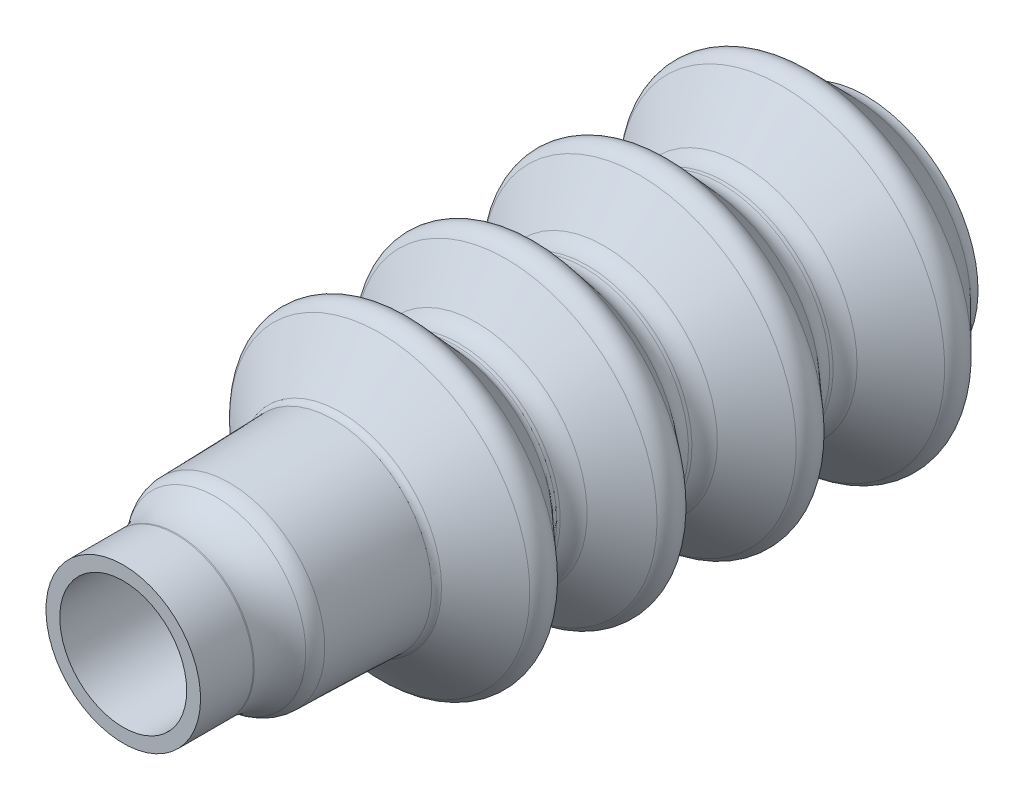
ISO-10303-21;
HEADER;
FILE_DESCRIPTION(('STEP AP214'),'2;1');
FILE_NAME('part.step','',(''),(''),'','','');
FILE_SCHEMA(('AUTOMOTIVE_DESIGN { 1 0 10303 214 1 1 1 1 }'));
ENDSEC;
DATA;
#1=APPLICATION_CONTEXT('core data for automotive mechanical design processes');
#2=APPLICATION_PROTOCOL_DEFINITION('international standard','automotive_design',2000,#1);
#3=PRODUCT_CONTEXT('',#1,'mechanical');
#4=PRODUCT('Part','Part','',(#3));
#5=PRODUCT_RELATED_PRODUCT_CATEGORY('part','',(#4));
#6=PRODUCT_DEFINITION_FORMATION('','',#4);
#7=PRODUCT_DEFINITION_CONTEXT('part definition',#1,'design');
#8=PRODUCT_DEFINITION('design','',#6,#7);
#9=PRODUCT_DEFINITION_SHAPE('','',#8);
#10=(LENGTH_UNIT() NAMED_UNIT(*) SI_UNIT(.MILLI.,.METRE.));
#11=(NAMED_UNIT(*) PLANE_ANGLE_UNIT() SI_UNIT($,.RADIAN.));
#12=(NAMED_UNIT(*) SI_UNIT($,.STERADIAN.) SOLID_ANGLE_UNIT());
#13=UNCERTAINTY_MEASURE_WITH_UNIT(LENGTH_MEASURE(1.E-05),#10,'distance_accuracy_value','');
#14=(GEOMETRIC_REPRESENTATION_CONTEXT(3) GLOBAL_UNCERTAINTY_ASSIGNED_CONTEXT((#13)) GLOBAL_UNIT_ASSIGNED_CONTEXT((#10,
#11,#12)) REPRESENTATION_CONTEXT('',''));
#15=CARTESIAN_POINT('',(0.,0.,0.));
#16=DIRECTION('',(0.,0.,1.));
#17=DIRECTION('',(1.,0.,0.));
#18=AXIS2_PLACEMENT_3D('',#15,#16,#17);
#19=CARTESIAN_POINT('',(0.,0.,200.924419226983));
#20=DIRECTION('',(0.,0.,-1.));
#21=DIRECTION('',(0.,1.,0.));
#22=AXIS2_PLACEMENT_3D('',#19,#20,#21);
#23=DEGENERATE_TOROIDAL_SURFACE('',#22,4.6967449700803,7.95870313609752,.T.);
#24=CARTESIAN_POINT('',(0.,0.,208.497603629338));
#25=DIRECTION('',(0.,0.,-1.));
#26=DIRECTION('',(0.,1.,0.));
#27=AXIS2_PLACEMENT_3D('',#24,#25,#26);
#28=CIRCLE('',#27,7.14375);
#29=CARTESIAN_POINT('',(7.14375,0.,208.497603629338));
#30=VERTEX_POINT('',#29);
#31=EDGE_CURVE('E126',#30,#30,#28,.F.);
#32=ORIENTED_EDGE('',*,*,#31,.T.);
#33=EDGE_LOOP('',(#32));
#34=FACE_BOUND('',#33,.T.);
#35=CARTESIAN_POINT('',(0.,0.,201.27525547891));
#36=DIRECTION('',(0.,0.,-1.));
#37=DIRECTION('',(0.,1.,0.));
#38=AXIS2_PLACEMENT_3D('',#35,#36,#37);
#39=CIRCLE('',#38,12.6477115486079);
#40=CARTESIAN_POINT('',(0.,12.6477115486078,201.27525547891));
#41=VERTEX_POINT('',#40);
#42=EDGE_CURVE('E10',#41,#41,#39,.T.);
#43=ORIENTED_EDGE('',*,*,#42,.T.);
#44=EDGE_LOOP('',(#43));
#45=FACE_BOUND('',#44,.T.);
#46=ADVANCED_FACE('F32',(#34,#45),#23,.F.);
#47=CARTESIAN_POINT('',(0.,0.,201.057580808511));
#48=DIRECTION('',(0.,0.,-1.));
#49=DIRECTION('',(0.,1.,0.));
#50=AXIS2_PLACEMENT_3D('',#47,#48,#49);
#51=TOROIDAL_SURFACE('',#50,15.1783671430867,2.54000000000006);
#52=ORIENTED_EDGE('',*,*,#42,.F.);
#53=EDGE_LOOP('',(#52));
#54=FACE_BOUND('',#53,.T.);
#55=CARTESIAN_POINT('',(0.,0.,202.870414529049));
#56=DIRECTION('',(0.,0.,-1.));
#57=DIRECTION('',(0.,1.,0.));
#58=AXIS2_PLACEMENT_3D('',#55,#56,#57);
#59=CIRCLE('',#58,13.3992567188346);
#60=CARTESIAN_POINT('',(0.,13.3992567188345,202.870414529049));
#61=VERTEX_POINT('',#60);
#62=EDGE_CURVE('E38',#61,#61,#59,.T.);
#63=ORIENTED_EDGE('',*,*,#62,.T.);
#64=EDGE_LOOP('',(#63));
#65=FACE_BOUND('',#64,.T.);
#66=ADVANCED_FACE('F161',(#54,#65),#51,.F.);
#67=CARTESIAN_POINT('',(0.,0.,202.870414529049));
#68=DIRECTION('',(0.,0.,1.));
#69=DIRECTION('',(0.,-1.,0.));
#70=AXIS2_PLACEMENT_3D('',#67,#68,#69);
#71=CONICAL_SURFACE('',#70,13.3992567188346,0.794786479062883);
#72=CARTESIAN_POINT('',(0.,0.,207.765783323296));
#73=DIRECTION('',(0.,0.,-1.));
#74=DIRECTION('',(0.,1.,0.));
#75=AXIS2_PLACEMENT_3D('',#72,#73,#74);
#76=CIRCLE('',#75,18.3874179390181);
#77=CARTESIAN_POINT('',(0.,18.3874179390181,207.765783323296));
#78=VERTEX_POINT('',#77);
#79=EDGE_CURVE('E42',#78,#78,#76,.T.);
#80=ORIENTED_EDGE('',*,*,#79,.T.);
#81=EDGE_LOOP('',(#80));
#82=FACE_BOUND('',#81,.T.);
#83=ORIENTED_EDGE('',*,*,#62,.F.);
#84=EDGE_LOOP('',(#83));
#85=FACE_BOUND('',#84,.T.);
#86=ADVANCED_FACE('F166',(#82,#85),#71,.T.);
#87=CARTESIAN_POINT('',(0.,0.,209.193211449703));
#88=DIRECTION('',(0.,0.,-1.));
#89=DIRECTION('',(0.,1.,0.));
#90=AXIS2_PLACEMENT_3D('',#87,#88,#89);
#91=TOROIDAL_SURFACE('',#90,16.9865435892133,2.);
#92=CARTESIAN_POINT('',(0.,0.,210.693138532909));
#93=DIRECTION('',(0.,0.,-1.));
#94=DIRECTION('',(0.,1.,0.));
#95=AXIS2_PLACEMENT_3D('',#92,#93,#94);
#96=CIRCLE('',#95,18.3095019200254);
#97=CARTESIAN_POINT('',(0.,18.3095019200254,210.693138532909));
#98=VERTEX_POINT('',#97);
#99=EDGE_CURVE('E46',#98,#98,#96,.T.);
#100=ORIENTED_EDGE('',*,*,#99,.T.);
#101=EDGE_LOOP('',(#100));
#102=FACE_BOUND('',#101,.T.);
#103=ORIENTED_EDGE('',*,*,#79,.F.);
#104=EDGE_LOOP('',(#103));
#105=FACE_BOUND('',#104,.T.);
#106=ADVANCED_FACE('F203',(#102,#105),#91,.T.);
#107=CARTESIAN_POINT('',(0.,0.,210.693138532909));
#108=DIRECTION('',(0.,0.,-1.));
#109=DIRECTION('',(0.,1.,0.));
#110=AXIS2_PLACEMENT_3D('',#107,#108,#109);
#111=CONICAL_SURFACE('',#110,18.3095019200254,0.848006960788617);
#112=CARTESIAN_POINT('',(0.,0.,215.316229054661));
#113=DIRECTION('',(0.,0.,-1.));
#114=DIRECTION('',(0.,1.,0.));
#115=AXIS2_PLACEMENT_3D('',#112,#113,#114);
#116=CIRCLE('',#115,13.0679924029183);
#117=CARTESIAN_POINT('',(0.,13.0679924029183,215.316229054661));
#118=VERTEX_POINT('',#117);
#119=EDGE_CURVE('E51',#118,#118,#116,.T.);
#120=ORIENTED_EDGE('',*,*,#119,.T.);
#121=EDGE_LOOP('',(#120));
#122=FACE_BOUND('',#121,.T.);
#123=ORIENTED_EDGE('',*,*,#99,.F.);
#124=EDGE_LOOP('',(#123));
#125=FACE_BOUND('',#124,.T.);
#126=ADVANCED_FACE('F212',(#122,#125),#111,.T.);
#127=CARTESIAN_POINT('',(0.,0.,217.221136450332));
#128=DIRECTION('',(0.,0.,-1.));
#129=DIRECTION('',(0.,1.,0.));
#130=AXIS2_PLACEMENT_3D('',#127,#128,#129);
#131=TOROIDAL_SURFACE('',#130,14.7481494830497,2.54000000000005);
#132=CARTESIAN_POINT('',(0.,0.,217.153554415061));
#133=DIRECTION('',(0.,0.,-1.));
#134=DIRECTION('',(0.,1.,0.));
#135=AXIS2_PLACEMENT_3D('',#132,#133,#134);
#136=CIRCLE('',#135,12.2090487232316);
#137=CARTESIAN_POINT('',(0.,12.2090487232316,217.153554415061));
#138=VERTEX_POINT('',#137);
#139=EDGE_CURVE('E54',#138,#138,#136,.T.);
#140=ORIENTED_EDGE('',*,*,#139,.T.);
#141=EDGE_LOOP('',(#140));
#142=FACE_BOUND('',#141,.T.);
#143=ORIENTED_EDGE('',*,*,#119,.F.);
#144=EDGE_LOOP('',(#143));
#145=FACE_BOUND('',#144,.T.);
#146=ADVANCED_FACE('F221',(#142,#145),#131,.F.);
#147=CARTESIAN_POINT('',(0.,0.,217.153554415061));
#148=DIRECTION('',(0.,0.,-1.));
#149=DIRECTION('',(0.,1.,0.));
#150=AXIS2_PLACEMENT_3D('',#147,#148,#149);
#151=CONICAL_SURFACE('',#150,12.2090487232316,0.0266102408628674);
#152=CARTESIAN_POINT('',(0.,0.,217.531345726088));
#153=DIRECTION('',(0.,0.,-1.));
#154=DIRECTION('',(0.,1.,0.));
#155=AXIS2_PLACEMENT_3D('',#152,#153,#154);
#156=CIRCLE('',#155,12.1989932318896);
#157=CARTESIAN_POINT('',(0.,12.1989932318896,217.531345726088));
#158=VERTEX_POINT('',#157);
#159=EDGE_CURVE('E57',#158,#158,#156,.T.);
#160=ORIENTED_EDGE('',*,*,#159,.T.);
#161=EDGE_LOOP('',(#160));
#162=FACE_BOUND('',#161,.T.);
#163=ORIENTED_EDGE('',*,*,#139,.F.);
#164=EDGE_LOOP('',(#163));
#165=FACE_BOUND('',#164,.T.);
#166=ADVANCED_FACE('F230',(#162,#165),#151,.T.);
#167=CARTESIAN_POINT('',(0.,0.,217.598927761359));
#168=DIRECTION('',(0.,0.,-1.));
#169=DIRECTION('',(0.,1.,0.));
#170=AXIS2_PLACEMENT_3D('',#167,#168,#169);
#171=TOROIDAL_SURFACE('',#170,14.7380939917077,2.54000000000005);
#172=ORIENTED_EDGE('',*,*,#159,.F.);
#173=EDGE_LOOP('',(#172));
#174=FACE_BOUND('',#173,.T.);
#175=CARTESIAN_POINT('',(0.,0.,219.489494365287));
#176=DIRECTION('',(0.,0.,-1.));
#177=DIRECTION('',(0.,1.,0.));
#178=AXIS2_PLACEMENT_3D('',#175,#176,#177);
#179=CIRCLE('',#178,13.0418163269033);
#180=CARTESIAN_POINT('',(0.,13.0418163269032,219.489494365287));
#181=VERTEX_POINT('',#180);
#182=EDGE_CURVE('E60',#181,#181,#179,.T.);
#183=ORIENTED_EDGE('',*,*,#182,.T.);
#184=EDGE_LOOP('',(#183));
#185=FACE_BOUND('',#184,.T.);
#186=ADVANCED_FACE('F239',(#174,#185),#171,.F.);
#187=CARTESIAN_POINT('',(0.,0.,219.489494365287));
#188=DIRECTION('',(0.,0.,1.));
#189=DIRECTION('',(0.,-1.,0.));
#190=AXIS2_PLACEMENT_3D('',#187,#188,#189);
#191=CONICAL_SURFACE('',#190,13.0418163269033,0.839512376060125);
#192=CARTESIAN_POINT('',(0.,0.,223.709085467749));
#193=DIRECTION('',(0.,0.,-1.));
#194=DIRECTION('',(0.,1.,0.));
#195=AXIS2_PLACEMENT_3D('',#192,#193,#194);
#196=CIRCLE('',#195,17.7447126663804);
#197=CARTESIAN_POINT('',(0.,17.7447126663804,223.709085467749));
#198=VERTEX_POINT('',#197);
#199=EDGE_CURVE('E63',#198,#198,#196,.T.);
#200=ORIENTED_EDGE('',*,*,#199,.T.);
#201=EDGE_LOOP('',(#200));
#202=FACE_BOUND('',#201,.T.);
#203=ORIENTED_EDGE('',*,*,#182,.F.);
#204=EDGE_LOOP('',(#203));
#205=FACE_BOUND('',#204,.T.);
#206=ADVANCED_FACE('F248',(#202,#205),#191,.T.);
#207=CARTESIAN_POINT('',(0.,0.,225.197720588952));
#208=DIRECTION('',(0.,0.,-1.));
#209=DIRECTION('',(0.,1.,0.));
#210=AXIS2_PLACEMENT_3D('',#207,#208,#209);
#211=TOROIDAL_SURFACE('',#210,16.40906096181,1.99999999999999);
#212=CARTESIAN_POINT('',(0.,0.,226.755298463272));
#213=DIRECTION('',(0.,0.,-1.));
#214=DIRECTION('',(0.,1.,0.));
#215=AXIS2_PLACEMENT_3D('',#212,#213,#214);
#216=CIRCLE('',#215,17.6636330663252);
#217=CARTESIAN_POINT('',(0.,17.6636330663252,226.755298463272));
#218=VERTEX_POINT('',#217);
#219=EDGE_CURVE('E66',#218,#218,#216,.T.);
#220=ORIENTED_EDGE('',*,*,#219,.T.);
#221=EDGE_LOOP('',(#220));
#222=FACE_BOUND('',#221,.T.);
#223=ORIENTED_EDGE('',*,*,#199,.F.);
#224=EDGE_LOOP('',(#223));
#225=FACE_BOUND('',#224,.T.);
#226=ADVANCED_FACE('F257',(#222,#225),#211,.T.);
#227=CARTESIAN_POINT('',(0.,0.,226.755298463272));
#228=DIRECTION('',(0.,0.,-1.));
#229=DIRECTION('',(0.,1.,0.));
#230=AXIS2_PLACEMENT_3D('',#227,#228,#229);
#231=CONICAL_SURFACE('',#230,17.6636330663252,0.89273285778585);
#232=CARTESIAN_POINT('',(0.,0.,230.71874287883));
#233=DIRECTION('',(0.,0.,-1.));
#234=DIRECTION('',(0.,1.,0.));
#235=AXIS2_PLACEMENT_3D('',#232,#233,#234);
#236=CIRCLE('',#235,12.7429327689458);
#237=CARTESIAN_POINT('',(0.,12.7429327689458,230.71874287883));
#238=VERTEX_POINT('',#237);
#239=EDGE_CURVE('E69',#238,#238,#236,.T.);
#240=ORIENTED_EDGE('',*,*,#239,.T.);
#241=EDGE_LOOP('',(#240));
#242=FACE_BOUND('',#241,.T.);
#243=ORIENTED_EDGE('',*,*,#219,.F.);
#244=EDGE_LOOP('',(#243));
#245=FACE_BOUND('',#244,.T.);
#246=ADVANCED_FACE('F266',(#242,#245),#231,.T.);
#247=CARTESIAN_POINT('',(0.,0.,232.696866779217));
#248=DIRECTION('',(0.,0.,-1.));
#249=DIRECTION('',(0.,1.,0.));
#250=AXIS2_PLACEMENT_3D('',#247,#248,#249);
#251=TOROIDAL_SURFACE('',#250,14.3362393416802,2.54000000000002);
#252=CARTESIAN_POINT('',(0.,0.,232.629284743946));
#253=DIRECTION('',(0.,0.,-1.));
#254=DIRECTION('',(0.,1.,0.));
#255=AXIS2_PLACEMENT_3D('',#252,#253,#254);
#256=CIRCLE('',#255,11.7971385818621);
#257=CARTESIAN_POINT('',(0.,11.7971385818621,232.629284743946));
#258=VERTEX_POINT('',#257);
#259=EDGE_CURVE('E72',#258,#258,#256,.T.);
#260=ORIENTED_EDGE('',*,*,#259,.T.);
#261=EDGE_LOOP('',(#260));
#262=FACE_BOUND('',#261,.T.);
#263=ORIENTED_EDGE('',*,*,#239,.F.);
#264=EDGE_LOOP('',(#263));
#265=FACE_BOUND('',#264,.T.);
#266=ADVANCED_FACE('F275',(#262,#265),#251,.F.);
#267=CARTESIAN_POINT('',(0.,0.,232.629284743946));
#268=DIRECTION('',(0.,0.,-1.));
#269=DIRECTION('',(0.,1.,0.));
#270=AXIS2_PLACEMENT_3D('',#267,#268,#269);
#271=CONICAL_SURFACE('',#270,11.7971385818621,0.0266102408628653);
#272=CARTESIAN_POINT('',(0.,0.,233.007076054973));
#273=DIRECTION('',(0.,0.,-1.));
#274=DIRECTION('',(0.,1.,0.));
#275=AXIS2_PLACEMENT_3D('',#272,#273,#274);
#276=CIRCLE('',#275,11.7870830905201);
#277=CARTESIAN_POINT('',(0.,11.7870830905201,233.007076054973));
#278=VERTEX_POINT('',#277);
#279=EDGE_CURVE('E75',#278,#278,#276,.T.);
#280=ORIENTED_EDGE('',*,*,#279,.T.);
#281=EDGE_LOOP('',(#280));
#282=FACE_BOUND('',#281,.T.);
#283=ORIENTED_EDGE('',*,*,#259,.F.);
#284=EDGE_LOOP('',(#283));
#285=FACE_BOUND('',#284,.T.);
#286=ADVANCED_FACE('F284',(#282,#285),#271,.T.);
#287=CARTESIAN_POINT('',(0.,0.,233.074658090244));
#288=DIRECTION('',(0.,0.,-1.));
#289=DIRECTION('',(0.,1.,0.));
#290=AXIS2_PLACEMENT_3D('',#287,#288,#289);
#291=TOROIDAL_SURFACE('',#290,14.3261838503382,2.54000000000002);
#292=ORIENTED_EDGE('',*,*,#279,.F.);
#293=EDGE_LOOP('',(#292));
#294=FACE_BOUND('',#293,.T.);
#295=CARTESIAN_POINT('',(0.,0.,235.043806232902));
#296=DIRECTION('',(0.,0.,-1.));
#297=DIRECTION('',(0.,1.,0.));
#298=AXIS2_PLACEMENT_3D('',#295,#296,#297);
#299=CIRCLE('',#298,12.7217974903029);
#300=CARTESIAN_POINT('',(0.,12.7217974903029,235.043806232902));
#301=VERTEX_POINT('',#300);
#302=EDGE_CURVE('E78',#301,#301,#299,.T.);
#303=ORIENTED_EDGE('',*,*,#302,.T.);
#304=EDGE_LOOP('',(#303));
#305=FACE_BOUND('',#304,.T.);
#306=ADVANCED_FACE('F293',(#294,#305),#291,.F.);
#307=CARTESIAN_POINT('',(0.,0.,235.043806232902));
#308=DIRECTION('',(0.,0.,1.));
#309=DIRECTION('',(0.,-1.,0.));
#310=AXIS2_PLACEMENT_3D('',#307,#308,#309);
#311=CONICAL_SURFACE('',#310,12.7217974903029,0.887118976562982);
#312=CARTESIAN_POINT('',(0.,0.,238.600663215039));
#313=DIRECTION('',(0.,0.,-1.));
#314=DIRECTION('',(0.,1.,0.));
#315=AXIS2_PLACEMENT_3D('',#312,#313,#314);
#316=CIRCLE('',#315,17.0873159804509);
#317=CARTESIAN_POINT('',(0.,17.0873159804509,238.600663215039));
#318=VERTEX_POINT('',#317);
#319=EDGE_CURVE('E81',#318,#318,#316,.T.);
#320=ORIENTED_EDGE('',*,*,#319,.T.);
#321=EDGE_LOOP('',(#320));
#322=FACE_BOUND('',#321,.T.);
#323=ORIENTED_EDGE('',*,*,#302,.F.);
#324=EDGE_LOOP('',(#323));
#325=FACE_BOUND('',#324,.T.);
#326=ADVANCED_FACE('F302',(#322,#325),#311,.T.);
#327=CARTESIAN_POINT('',(0.,0.,240.151173563589));
#328=DIRECTION('',(0.,0.,-1.));
#329=DIRECTION('',(0.,1.,0.));
#330=AXIS2_PLACEMENT_3D('',#327,#328,#329);
#331=TOROIDAL_SURFACE('',#330,15.8240196339665,2.00000000000007);
#332=CARTESIAN_POINT('',(0.,0.,241.766690088202));
#333=DIRECTION('',(0.,0.,-1.));
#334=DIRECTION('',(0.,1.,0.));
#335=AXIS2_PLACEMENT_3D('',#332,#333,#334);
#336=CIRCLE('',#335,17.0030473514952);
#337=CARTESIAN_POINT('',(0.,17.0030473514952,241.766690088202));
#338=VERTEX_POINT('',#337);
#339=EDGE_CURVE('E84',#338,#338,#336,.T.);
#340=ORIENTED_EDGE('',*,*,#339,.T.);
#341=EDGE_LOOP('',(#340));
#342=FACE_BOUND('',#341,.T.);
#343=ORIENTED_EDGE('',*,*,#319,.F.);
#344=EDGE_LOOP('',(#343));
#345=FACE_BOUND('',#344,.T.);
#346=ADVANCED_FACE('F311',(#342,#345),#331,.T.);
#347=CARTESIAN_POINT('',(0.,0.,241.766690088202));
#348=DIRECTION('',(0.,0.,-1.));
#349=DIRECTION('',(0.,1.,0.));
#350=AXIS2_PLACEMENT_3D('',#347,#348,#349);
#351=CONICAL_SURFACE('',#350,17.0030473514952,0.94033945828872);
#352=CARTESIAN_POINT('',(0.,0.,245.086285669156));
#353=DIRECTION('',(0.,0.,-1.));
#354=DIRECTION('',(0.,1.,0.));
#355=AXIS2_PLACEMENT_3D('',#352,#353,#354);
#356=CIRCLE('',#355,12.4545015994869);
#357=CARTESIAN_POINT('',(0.,12.4545015994869,245.086285669156));
#358=VERTEX_POINT('',#357);
#359=EDGE_CURVE('E87',#358,#358,#356,.T.);
#360=ORIENTED_EDGE('',*,*,#359,.T.);
#361=EDGE_LOOP('',(#360));
#362=FACE_BOUND('',#361,.T.);
#363=ORIENTED_EDGE('',*,*,#339,.F.);
#364=EDGE_LOOP('',(#363));
#365=FACE_BOUND('',#364,.T.);
#366=ADVANCED_FACE('F320',(#362,#365),#351,.T.);
#367=CARTESIAN_POINT('',(0.,0.,247.137991655416));
#368=DIRECTION('',(0.,0.,-1.));
#369=DIRECTION('',(0.,1.,0.));
#370=AXIS2_PLACEMENT_3D('',#367,#368,#369);
#371=TOROIDAL_SURFACE('',#370,13.9518668007483,2.53999999999997);
#372=CARTESIAN_POINT('',(0.,0.,247.070409620145));
#373=DIRECTION('',(0.,0.,-1.));
#374=DIRECTION('',(0.,1.,0.));
#375=AXIS2_PLACEMENT_3D('',#372,#373,#374);
#376=CIRCLE('',#375,11.4127660409303);
#377=CARTESIAN_POINT('',(0.,11.4127660409303,247.070409620145));
#378=VERTEX_POINT('',#377);
#379=EDGE_CURVE('E90',#378,#378,#376,.T.);
#380=ORIENTED_EDGE('',*,*,#379,.T.);
#381=EDGE_LOOP('',(#380));
#382=FACE_BOUND('',#381,.T.);
#383=ORIENTED_EDGE('',*,*,#359,.F.);
#384=EDGE_LOOP('',(#383));
#385=FACE_BOUND('',#384,.T.);
#386=ADVANCED_FACE('F329',(#382,#385),#371,.F.);
#387=CARTESIAN_POINT('',(0.,0.,247.070409620145));
#388=DIRECTION('',(0.,0.,-1.));
#389=DIRECTION('',(0.,1.,0.));
#390=AXIS2_PLACEMENT_3D('',#387,#388,#389);
#391=CONICAL_SURFACE('',#390,11.4127660409303,0.026610240862866);
#392=CARTESIAN_POINT('',(0.,0.,247.448200931171));
#393=DIRECTION('',(0.,0.,-1.));
#394=DIRECTION('',(0.,1.,0.));
#395=AXIS2_PLACEMENT_3D('',#392,#393,#394);
#396=CIRCLE('',#395,11.4027105495883);
#397=CARTESIAN_POINT('',(0.,11.4027105495883,247.448200931171));
#398=VERTEX_POINT('',#397);
#399=EDGE_CURVE('E93',#398,#398,#396,.T.);
#400=ORIENTED_EDGE('',*,*,#399,.T.);
#401=EDGE_LOOP('',(#400));
#402=FACE_BOUND('',#401,.T.);
#403=ORIENTED_EDGE('',*,*,#379,.F.);
#404=EDGE_LOOP('',(#403));
#405=FACE_BOUND('',#404,.T.);
#406=ADVANCED_FACE('F338',(#402,#405),#391,.T.);
#407=CARTESIAN_POINT('',(0.,0.,247.474808031672));
#408=DIRECTION('',(0.,0.,-1.));
#409=DIRECTION('',(0.,1.,0.));
#410=AXIS2_PLACEMENT_3D('',#407,#408,#409);
#411=TOROIDAL_SURFACE('',#410,12.4023565180206,0.999999999999962);
#412=ORIENTED_EDGE('',*,*,#399,.F.);
#413=EDGE_LOOP('',(#412));
#414=FACE_BOUND('',#413,.T.);
#415=CARTESIAN_POINT('',(0.,0.,248.217643136089));
#416=DIRECTION('',(0.,0.,-1.));
#417=DIRECTION('',(0.,1.,0.));
#418=AXIS2_PLACEMENT_3D('',#415,#416,#417);
#419=CIRCLE('',#418,11.7328820915892);
#420=CARTESIAN_POINT('',(0.,11.7328820915892,248.217643136089));
#421=VERTEX_POINT('',#420);
#422=EDGE_CURVE('E96',#421,#421,#419,.T.);
#423=ORIENTED_EDGE('',*,*,#422,.T.);
#424=EDGE_LOOP('',(#423));
#425=FACE_BOUND('',#424,.T.);
#426=ADVANCED_FACE('F347',(#414,#425),#411,.F.);
#427=CARTESIAN_POINT('',(0.,0.,248.217643136089));
#428=DIRECTION('',(0.,0.,1.));
#429=DIRECTION('',(0.,-1.,0.));
#430=AXIS2_PLACEMENT_3D('',#427,#428,#429);
#431=CONICAL_SURFACE('',#430,11.7328820915892,0.83729528899207);
#432=CARTESIAN_POINT('',(0.,0.,252.944731068762));
#433=DIRECTION('',(0.,0.,-1.));
#434=DIRECTION('',(0.,1.,0.));
#435=AXIS2_PLACEMENT_3D('',#432,#433,#434);
#436=CIRCLE('',#435,16.9779619922117);
#437=CARTESIAN_POINT('',(0.,16.9779619922117,252.944731068762));
#438=VERTEX_POINT('',#437);
#439=EDGE_CURVE('E99',#438,#438,#436,.T.);
#440=ORIENTED_EDGE('',*,*,#439,.T.);
#441=EDGE_LOOP('',(#440));
#442=FACE_BOUND('',#441,.T.);
#443=ORIENTED_EDGE('',*,*,#422,.F.);
#444=EDGE_LOOP('',(#443));
#445=FACE_BOUND('',#444,.T.);
#446=ADVANCED_FACE('F356',(#442,#445),#431,.T.);
#447=CARTESIAN_POINT('',(0.,0.,254.430401277596));
#448=DIRECTION('',(0.,0.,-1.));
#449=DIRECTION('',(0.,1.,0.));
#450=AXIS2_PLACEMENT_3D('',#447,#448,#449);
#451=TOROIDAL_SURFACE('',#450,15.6390131393488,2.00000000000002);
#452=CARTESIAN_POINT('',(0.,0.,255.985193830491));
#453=DIRECTION('',(0.,0.,-1.));
#454=DIRECTION('',(0.,1.,0.));
#455=AXIS2_PLACEMENT_3D('',#452,#453,#454);
#456=CIRCLE('',#455,16.8970354433899);
#457=CARTESIAN_POINT('',(0.,16.8970354433899,255.985193830491));
#458=VERTEX_POINT('',#457);
#459=EDGE_CURVE('E102',#458,#458,#456,.T.);
#460=ORIENTED_EDGE('',*,*,#459,.T.);
#461=EDGE_LOOP('',(#460));
#462=FACE_BOUND('',#461,.T.);
#463=ORIENTED_EDGE('',*,*,#439,.F.);
#464=EDGE_LOOP('',(#463));
#465=FACE_BOUND('',#464,.T.);
#466=ADVANCED_FACE('F365',(#462,#465),#451,.T.);
#467=CARTESIAN_POINT('',(0.,0.,255.985193830491));
#468=DIRECTION('',(0.,0.,-1.));
#469=DIRECTION('',(0.,1.,0.));
#470=AXIS2_PLACEMENT_3D('',#467,#468,#469);
#471=CONICAL_SURFACE('',#470,16.8970354433899,0.890515770717803);
#472=CARTESIAN_POINT('',(0.,0.,260.426574873352));
#473=DIRECTION('',(0.,0.,-1.));
#474=DIRECTION('',(0.,1.,0.));
#475=AXIS2_PLACEMENT_3D('',#472,#473,#474);
#476=CIRCLE('',#475,11.4079227719969);
#477=CARTESIAN_POINT('',(0.,11.4079227719969,260.426574873352));
#478=VERTEX_POINT('',#477);
#479=EDGE_CURVE('E105',#478,#478,#476,.T.);
#480=ORIENTED_EDGE('',*,*,#479,.T.);
#481=EDGE_LOOP('',(#480));
#482=FACE_BOUND('',#481,.T.);
#483=ORIENTED_EDGE('',*,*,#459,.F.);
#484=EDGE_LOOP('',(#483));
#485=FACE_BOUND('',#484,.T.);
#486=ADVANCED_FACE('F374',(#482,#485),#471,.T.);
#487=CARTESIAN_POINT('',(0.,0.,261.203971149799));
#488=DIRECTION('',(0.,0.,-1.));
#489=DIRECTION('',(0.,1.,0.));
#490=AXIS2_PLACEMENT_3D('',#487,#488,#489);
#491=TOROIDAL_SURFACE('',#490,12.0369339240175,0.999999999999963);
#492=CARTESIAN_POINT('',(0.,0.,261.177364049299));
#493=DIRECTION('',(0.,0.,-1.));
#494=DIRECTION('',(0.,1.,0.));
#495=AXIS2_PLACEMENT_3D('',#492,#493,#494);
#496=CIRCLE('',#495,11.0372879555852);
#497=CARTESIAN_POINT('',(0.,11.0372879555852,261.177364049299));
#498=VERTEX_POINT('',#497);
#499=EDGE_CURVE('E108',#498,#498,#496,.T.);
#500=ORIENTED_EDGE('',*,*,#499,.T.);
#501=EDGE_LOOP('',(#500));
#502=FACE_BOUND('',#501,.T.);
#503=ORIENTED_EDGE('',*,*,#479,.F.);
#504=EDGE_LOOP('',(#503));
#505=FACE_BOUND('',#504,.T.);
#506=ADVANCED_FACE('F383',(#502,#505),#491,.F.);
#507=CARTESIAN_POINT('',(0.,0.,261.177364049299));
#508=DIRECTION('',(0.,0.,-1.));
#509=DIRECTION('',(0.,1.,0.));
#510=AXIS2_PLACEMENT_3D('',#507,#508,#509);
#511=CONICAL_SURFACE('',#510,11.0372879555852,0.0266102408628676);
#512=CARTESIAN_POINT('',(0.,0.,272.887414197989));
#513=DIRECTION('',(0.,0.,-1.));
#514=DIRECTION('',(0.,1.,0.));
#515=AXIS2_PLACEMENT_3D('',#512,#513,#514);
#516=CIRCLE('',#515,10.7256071295638);
#517=CARTESIAN_POINT('',(0.,10.7256071295638,272.887414197989));
#518=VERTEX_POINT('',#517);
#519=EDGE_CURVE('E111',#518,#518,#516,.T.);
#520=ORIENTED_EDGE('',*,*,#519,.T.);
#521=EDGE_LOOP('',(#520));
#522=FACE_BOUND('',#521,.T.);
#523=ORIENTED_EDGE('',*,*,#499,.F.);
#524=EDGE_LOOP('',(#523));
#525=FACE_BOUND('',#524,.T.);
#526=ADVANCED_FACE('F392',(#522,#525),#511,.T.);
#527=CARTESIAN_POINT('',(0.,0.,272.819832162719));
#528=DIRECTION('',(0.,0.,-1.));
#529=DIRECTION('',(0.,1.,0.));
#530=AXIS2_PLACEMENT_3D('',#527,#528,#529);
#531=TOROIDAL_SURFACE('',#530,8.18650636974575,2.53999999999999);
#532=ORIENTED_EDGE('',*,*,#519,.F.);
#533=EDGE_LOOP('',(#532));
#534=FACE_BOUND('',#533,.T.);
#535=CARTESIAN_POINT('',(0.,0.,274.440639243521));
#536=DIRECTION('',(0.,0.,-1.));
#537=DIRECTION('',(0.,1.,0.));
#538=AXIS2_PLACEMENT_3D('',#535,#536,#537);
#539=CIRCLE('',#538,10.1421608399474);
#540=CARTESIAN_POINT('',(0.,10.1421608399474,274.440639243521));
#541=VERTEX_POINT('',#540);
#542=EDGE_CURVE('E114',#541,#541,#539,.T.);
#543=ORIENTED_EDGE('',*,*,#542,.T.);
#544=EDGE_LOOP('',(#543));
#545=FACE_BOUND('',#544,.T.);
#546=ADVANCED_FACE('F156',(#534,#545),#531,.T.);
#547=CARTESIAN_POINT('',(0.,0.,278.47207655603));
#548=DIRECTION('',(0.,0.,-1.));
#549=DIRECTION('',(0.,1.,0.));
#550=AXIS2_PLACEMENT_3D('',#547,#548,#549);
#551=TOROIDAL_SURFACE('',#550,15.0064648616452,6.31774804975554);
#552=CARTESIAN_POINT('',(0.,0.,278.79085812645));
#553=DIRECTION('',(0.,0.,-1.));
#554=DIRECTION('',(0.,1.,0.));
#555=AXIS2_PLACEMENT_3D('',#552,#553,#554);
#556=CIRCLE('',#555,8.69676449391375);
#557=CARTESIAN_POINT('',(0.,8.69676449391372,278.79085812645));
#558=VERTEX_POINT('',#557);
#559=EDGE_CURVE('E117',#558,#558,#556,.T.);
#560=ORIENTED_EDGE('',*,*,#559,.T.);
#561=EDGE_LOOP('',(#560));
#562=FACE_BOUND('',#561,.T.);
#563=ORIENTED_EDGE('',*,*,#542,.F.);
#564=EDGE_LOOP('',(#563));
#565=FACE_BOUND('',#564,.T.);
#566=ADVANCED_FACE('F150',(#562,#565),#551,.F.);
#567=CARTESIAN_POINT('',(0.,0.,278.919021703485));
#568=DIRECTION('',(0.,0.,-1.));
#569=DIRECTION('',(0.,1.,0.));
#570=AXIS2_PLACEMENT_3D('',#567,#568,#569);
#571=TOROIDAL_SURFACE('',#570,6.16000000001187,2.53999999999997);
#572=ORIENTED_EDGE('',*,*,#559,.F.);
#573=EDGE_LOOP('',(#572));
#574=FACE_BOUND('',#573,.T.);
#575=CARTESIAN_POINT('',(0.,0.,278.919021703485));
#576=DIRECTION('',(0.,0.,-1.));
#577=DIRECTION('',(0.,1.,0.));
#578=AXIS2_PLACEMENT_3D('',#575,#576,#577);
#579=CIRCLE('',#578,8.70000000001184);
#580=CARTESIAN_POINT('',(0.,8.70000000001181,278.919021703485));
#581=VERTEX_POINT('',#580);
#582=EDGE_CURVE('E120',#581,#581,#579,.T.);
#583=ORIENTED_EDGE('',*,*,#582,.T.);
#584=EDGE_LOOP('',(#583));
#585=FACE_BOUND('',#584,.T.);
#586=ADVANCED_FACE('F145',(#574,#585),#571,.T.);
#587=CARTESIAN_POINT('',(0.,0.,139.849490611376));
#588=DIRECTION('',(0.,0.,-1.));
#589=DIRECTION('',(0.,1.,0.));
#590=AXIS2_PLACEMENT_3D('',#587,#588,#589);
#591=CYLINDRICAL_SURFACE('',#590,8.70000000001183);
#592=CARTESIAN_POINT('',(0.,0.,284.849490611377));
#593=DIRECTION('',(0.,0.,-1.));
#594=DIRECTION('',(0.,1.,0.));
#595=AXIS2_PLACEMENT_3D('',#592,#593,#594);
#596=CIRCLE('',#595,8.70000000001182);
#597=CARTESIAN_POINT('',(0.,8.70000000001179,284.849490611377));
#598=VERTEX_POINT('',#597);
#599=EDGE_CURVE('E123',#598,#598,#596,.T.);
#600=ORIENTED_EDGE('',*,*,#599,.T.);
#601=EDGE_LOOP('',(#600));
#602=FACE_BOUND('',#601,.T.);
#603=ORIENTED_EDGE('',*,*,#582,.F.);
#604=EDGE_LOOP('',(#603));
#605=FACE_BOUND('',#604,.T.);
#606=ADVANCED_FACE('F139',(#602,#605),#591,.T.);
#607=CARTESIAN_POINT('',(0.,-5.78852174726847E-12,284.849490611377));
#608=DIRECTION('',(0.,0.,1.));
#609=DIRECTION('',(0.,-1.,0.));
#610=AXIS2_PLACEMENT_3D('',#607,#608,#609);
#611=PLANE('',#610);
#612=CARTESIAN_POINT('',(0.,0.,284.849490611377));
#613=DIRECTION('',(0.,0.,1.));
#614=DIRECTION('',(1.,0.,0.));
#615=AXIS2_PLACEMENT_3D('',#612,#613,#614);
#616=CIRCLE('',#615,7.14375);
#617=CARTESIAN_POINT('',(7.14375,0.,284.849490611377));
#618=VERTEX_POINT('',#617);
#619=EDGE_CURVE('E129',#618,#618,#616,.T.);
#620=ORIENTED_EDGE('',*,*,#619,.F.);
#621=EDGE_LOOP('',(#620));
#622=FACE_BOUND('',#621,.T.);
#623=ORIENTED_EDGE('',*,*,#599,.F.);
#624=EDGE_LOOP('',(#623));
#625=FACE_BOUND('',#624,.T.);
#626=ADVANCED_FACE('F136',(#622,#625),#611,.T.);
#627=CARTESIAN_POINT('',(0.,0.,201.27525547891));
#628=DIRECTION('',(0.,0.,1.));
#629=DIRECTION('',(1.,0.,0.));
#630=AXIS2_PLACEMENT_3D('',#627,#628,#629);
#631=CYLINDRICAL_SURFACE('',#630,7.14375);
#632=CARTESIAN_POINT('',(7.14375,0.,284.849490611377));
#633=CARTESIAN_POINT('',(7.14375,0.,284.054158455314));
#634=CARTESIAN_POINT('',(7.14375,0.,283.258826299251));
#635=CARTESIAN_POINT('',(7.14375,0.,281.668161987125));
#636=CARTESIAN_POINT('',(7.14375,0.,280.872829831062));
#637=CARTESIAN_POINT('',(7.14375,0.,279.282165518936));
#638=CARTESIAN_POINT('',(7.14375,0.,278.486833362874));
#639=CARTESIAN_POINT('',(7.14375,0.,276.896169050748));
#640=CARTESIAN_POINT('',(7.14375,0.,276.100836894685));
#641=CARTESIAN_POINT('',(7.14375,0.,274.510172582559));
#642=CARTESIAN_POINT('',(7.14375,0.,273.714840426496));
#643=CARTESIAN_POINT('',(7.14375,0.,272.12417611437));
#644=CARTESIAN_POINT('',(7.14375,0.,271.328843958307));
#645=CARTESIAN_POINT('',(7.14375,0.,269.738179646182));
#646=CARTESIAN_POINT('',(7.14375,0.,268.942847490119));
#647=CARTESIAN_POINT('',(7.14375,0.,267.352183177993));
#648=CARTESIAN_POINT('',(7.14375,0.,266.55685102193));
#649=CARTESIAN_POINT('',(7.14375,0.,264.966186709804));
#650=CARTESIAN_POINT('',(7.14375,0.,264.170854553741));
#651=CARTESIAN_POINT('',(7.14375,0.,262.580190241615));
#652=CARTESIAN_POINT('',(7.14375,0.,261.784858085553));
#653=CARTESIAN_POINT('',(7.14375,0.,260.194193773427));
#654=CARTESIAN_POINT('',(7.14375,0.,259.398861617364));
#655=CARTESIAN_POINT('',(7.14375,0.,257.808197305238));
#656=CARTESIAN_POINT('',(7.14375,0.,257.012865149175));
#657=CARTESIAN_POINT('',(7.14375,0.,255.422200837049));
#658=CARTESIAN_POINT('',(7.14375,0.,254.626868680986));
#659=CARTESIAN_POINT('',(7.14375,0.,253.036204368861));
#660=CARTESIAN_POINT('',(7.14375,0.,252.240872212798));
#661=CARTESIAN_POINT('',(7.14375,0.,250.650207900672));
#662=CARTESIAN_POINT('',(7.14375,0.,249.854875744609));
#663=CARTESIAN_POINT('',(7.14375,0.,248.264211432483));
#664=CARTESIAN_POINT('',(7.14375,0.,247.46887927642));
#665=CARTESIAN_POINT('',(7.14375,0.,245.878214964294));
#666=CARTESIAN_POINT('',(7.14375,0.,245.082882808232));
#667=CARTESIAN_POINT('',(7.14375,0.,243.492218496106));
#668=CARTESIAN_POINT('',(7.14375,0.,242.696886340043));
#669=CARTESIAN_POINT('',(7.14375,0.,241.106222027917));
#670=CARTESIAN_POINT('',(7.14375,0.,240.310889871854));
#671=CARTESIAN_POINT('',(7.14375,0.,238.720225559728));
#672=CARTESIAN_POINT('',(7.14375,0.,237.924893403665));
#673=CARTESIAN_POINT('',(7.14375,0.,236.33422909154));
#674=CARTESIAN_POINT('',(7.14375,0.,235.538896935477));
#675=CARTESIAN_POINT('',(7.14375,0.,233.948232623351));
#676=CARTESIAN_POINT('',(7.14375,0.,233.152900467288));
#677=CARTESIAN_POINT('',(7.14375,0.,231.562236155162));
#678=CARTESIAN_POINT('',(7.14375,0.,230.766903999099));
#679=CARTESIAN_POINT('',(7.14375,0.,229.176239686973));
#680=CARTESIAN_POINT('',(7.14375,0.,228.38090753091));
#681=CARTESIAN_POINT('',(7.14375,0.,226.790243218785));
#682=CARTESIAN_POINT('',(7.14375,0.,225.994911062722));
#683=CARTESIAN_POINT('',(7.14375,0.,224.404246750596));
#684=CARTESIAN_POINT('',(7.14375,0.,223.608914594533));
#685=CARTESIAN_POINT('',(7.14375,0.,222.018250282407));
#686=CARTESIAN_POINT('',(7.14375,0.,221.222918126344));
#687=CARTESIAN_POINT('',(7.14375,0.,219.632253814219));
#688=CARTESIAN_POINT('',(7.14375,0.,218.836921658156));
#689=CARTESIAN_POINT('',(7.14375,0.,217.24625734603));
#690=CARTESIAN_POINT('',(7.14375,0.,216.450925189967));
#691=CARTESIAN_POINT('',(7.14375,0.,214.860260877841));
#692=CARTESIAN_POINT('',(7.14375,0.,214.064928721778));
#693=CARTESIAN_POINT('',(7.14375,0.,212.474264409652));
#694=CARTESIAN_POINT('',(7.14375,0.,211.678932253589));
#695=CARTESIAN_POINT('',(7.14375,0.,210.088267941464));
#696=CARTESIAN_POINT('',(7.14375,0.,209.292935785401));
#697=CARTESIAN_POINT('',(7.14375,0.,208.497603629338));
#698=B_SPLINE_CURVE_WITH_KNOTS('',3,(#632,#633,#634,#635,#636,#637,#638,#639,#640,#641,#642,
#643,#644,#645,#646,#647,#648,#649,#650,#651,#652,#653,#654,#655,#656,#657,#658,#659,#660,#661,
#662,#663,#664,#665,#666,#667,#668,#669,#670,#671,#672,#673,#674,#675,#676,#677,#678,#679,#680,
#681,#682,#683,#684,#685,#686,#687,#688,#689,#690,#691,#692,#693,#694,#695,#696,#697),
.UNSPECIFIED.,.F.,.F.,(4,2,2,2,2,2,2,2,2,2,2,2,2,2,2,2,2,2,2,2,2,2,2,2,2,2,2,2,2,2,2,2,4),(0.,
2.38599646818877,4.77199293637748,7.15798940456619,9.5439858727549,11.9299823409436,
14.3159788091323,16.701975277321,19.0879717455097,21.4739682136985,23.8599646818872,
26.2459611500759,28.6319576182646,31.0179540864534,33.4039505546421,35.7899470228308,
38.1759434910195,40.5619399592082,42.9479364273969,45.3339328955857,47.7199293637744,
50.1059258319631,52.4919223001518,54.8779187683405,57.2639152365293,59.649911704718,
62.0359081729067,64.4219046410954,66.8079011092841,69.1938975774729,71.5798940456616,
73.9658905138503,76.351886982039),.UNSPECIFIED.);
#699=EDGE_CURVE('BSEAM133',#618,#30,#698,.T.);
#700=ORIENTED_EDGE('',*,*,#619,.T.);
#701=ORIENTED_EDGE('',*,*,#31,.F.);
#702=ORIENTED_EDGE('',*,*,#699,.T.);
#703=ORIENTED_EDGE('',*,*,#699,.F.);
#704=EDGE_LOOP('',(#700,#702,#701,#703));
#705=FACE_BOUND('',#704,.T.);
#706=ADVANCED_FACE('F133',(#705),#631,.F.);
#707=CLOSED_SHELL('',(#46,#66,#86,#106,#126,#146,#166,#186,#206,#226,#246,#266,#286,#306,#326,
#346,#366,#386,#406,#426,#446,#466,#486,#506,#526,#546,#566,#586,#606,#626,#706));
#708=MANIFOLD_SOLID_BREP('B2',#707);
#709=ADVANCED_BREP_SHAPE_REPRESENTATION('',(#18,#708),#14);
#710=SHAPE_DEFINITION_REPRESENTATION(#9,#709);
ENDSEC;
END-ISO-10303-21;
